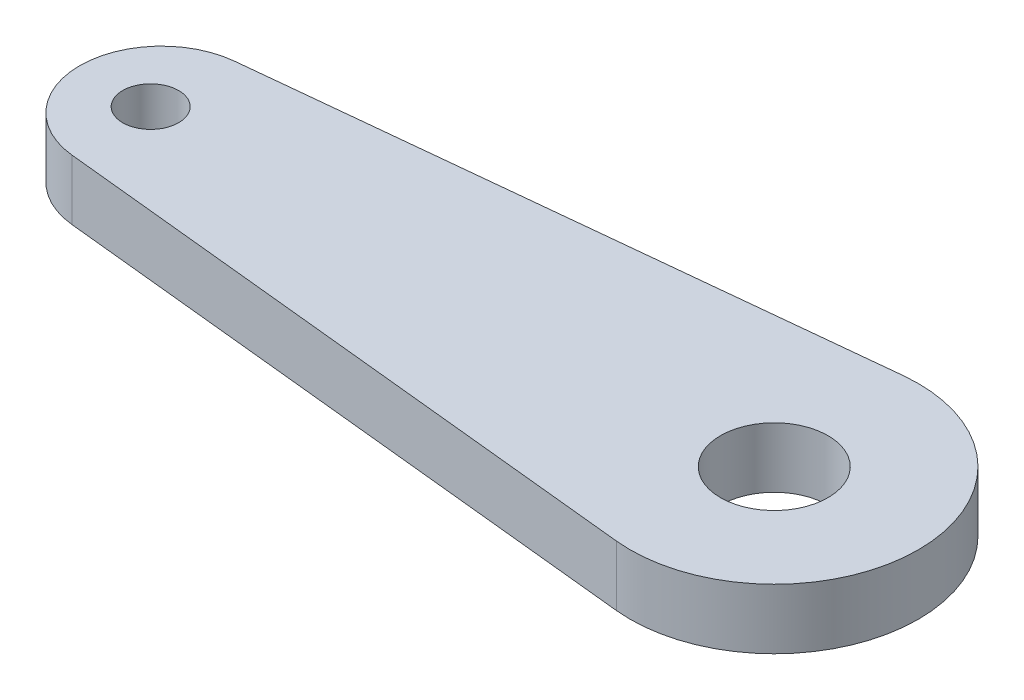
ISO-10303-21;
HEADER;
FILE_DESCRIPTION(('STEP AP214'),'2;1');
FILE_NAME('part.step','',(''),(''),'','','');
FILE_SCHEMA(('AUTOMOTIVE_DESIGN { 1 0 10303 214 1 1 1 1 }'));
ENDSEC;
DATA;
#1=APPLICATION_CONTEXT('core data for automotive mechanical design processes');
#2=APPLICATION_PROTOCOL_DEFINITION('international standard','automotive_design',2000,#1);
#3=PRODUCT_CONTEXT('',#1,'mechanical');
#4=PRODUCT('Part','Part','',(#3));
#5=PRODUCT_RELATED_PRODUCT_CATEGORY('part','',(#4));
#6=PRODUCT_DEFINITION_FORMATION('','',#4);
#7=PRODUCT_DEFINITION_CONTEXT('part definition',#1,'design');
#8=PRODUCT_DEFINITION('design','',#6,#7);
#9=PRODUCT_DEFINITION_SHAPE('','',#8);
#10=(LENGTH_UNIT() NAMED_UNIT(*) SI_UNIT(.MILLI.,.METRE.));
#11=(NAMED_UNIT(*) PLANE_ANGLE_UNIT() SI_UNIT($,.RADIAN.));
#12=(NAMED_UNIT(*) SI_UNIT($,.STERADIAN.) SOLID_ANGLE_UNIT());
#13=UNCERTAINTY_MEASURE_WITH_UNIT(LENGTH_MEASURE(1.E-05),#10,'distance_accuracy_value','');
#14=(GEOMETRIC_REPRESENTATION_CONTEXT(3) GLOBAL_UNCERTAINTY_ASSIGNED_CONTEXT((#13)) GLOBAL_UNIT_ASSIGNED_CONTEXT((#10,
#11,#12)) REPRESENTATION_CONTEXT('',''));
#15=CARTESIAN_POINT('',(0.,0.,0.));
#16=DIRECTION('',(0.,0.,1.));
#17=DIRECTION('',(1.,0.,0.));
#18=AXIS2_PLACEMENT_3D('',#15,#16,#17);
#19=CARTESIAN_POINT('',(-0.340877192982456,1.4,-3.33261199951396));
#20=DIRECTION('',(-0.101754385964912,0.,-0.994809552093718));
#21=DIRECTION('',(-0.994809552093718,0.,0.101754385964912));
#22=AXIS2_PLACEMENT_3D('',#19,#20,#21);
#23=PLANE('',#22);
#24=DIRECTION('',(0.994809552093718,0.,-0.101754385964912));
#25=VECTOR('',#24,1.);
#26=CARTESIAN_POINT('',(-0.340877192982456,0.,-3.33261199951396));
#27=LINE('',#26,#25);
#28=CARTESIAN_POINT('',(-14.4433333333333,0.,-1.89013814897806));
#29=VERTEX_POINT('',#28);
#30=CARTESIAN_POINT('',(-0.340877192982456,0.,-3.33261199951396));
#31=VERTEX_POINT('',#30);
#32=EDGE_CURVE('E112',#29,#31,#27,.T.);
#33=ORIENTED_EDGE('',*,*,#32,.F.);
#34=DIRECTION('',(0.,-1.,0.));
#35=VECTOR('',#34,1.);
#36=CARTESIAN_POINT('',(-14.4433333333333,1.4,-1.89013814897806));
#37=LINE('',#36,#35);
#38=CARTESIAN_POINT('',(-14.4433333333333,1.4,-1.89013814897806));
#39=VERTEX_POINT('',#38);
#40=EDGE_CURVE('E11',#39,#29,#37,.T.);
#41=ORIENTED_EDGE('',*,*,#40,.F.);
#42=DIRECTION('',(0.994809552093718,0.,-0.101754385964912));
#43=VECTOR('',#42,1.);
#44=CARTESIAN_POINT('',(-0.340877192982456,1.4,-3.33261199951396));
#45=LINE('',#44,#43);
#46=CARTESIAN_POINT('',(-0.340877192982456,1.4,-3.33261199951396));
#47=VERTEX_POINT('',#46);
#48=EDGE_CURVE('E94',#39,#47,#45,.T.);
#49=ORIENTED_EDGE('',*,*,#48,.T.);
#50=DIRECTION('',(0.,-1.,0.));
#51=VECTOR('',#50,1.);
#52=CARTESIAN_POINT('',(-0.340877192982456,1.4,-3.33261199951396));
#53=LINE('',#52,#51);
#54=EDGE_CURVE('E82',#47,#31,#53,.T.);
#55=ORIENTED_EDGE('',*,*,#54,.T.);
#56=EDGE_LOOP('',(#33,#41,#49,#55));
#57=FACE_BOUND('',#56,.T.);
#58=ADVANCED_FACE('F43',(#57),#23,.T.);
#59=CARTESIAN_POINT('',(-14.25,1.4,0.));
#60=DIRECTION('',(0.,-1.,0.));
#61=DIRECTION('',(0.,0.,-1.));
#62=AXIS2_PLACEMENT_3D('',#59,#60,#61);
#63=CYLINDRICAL_SURFACE('',#62,1.9);
#64=CARTESIAN_POINT('',(-14.25,0.,0.));
#65=DIRECTION('',(0.,1.,0.));
#66=DIRECTION('',(0.,0.,1.));
#67=AXIS2_PLACEMENT_3D('',#64,#65,#66);
#68=CIRCLE('',#67,1.9);
#69=CARTESIAN_POINT('',(-14.4433333333333,0.,1.89013814897806));
#70=VERTEX_POINT('',#69);
#71=EDGE_CURVE('E99',#29,#70,#68,.T.);
#72=ORIENTED_EDGE('',*,*,#71,.T.);
#73=DIRECTION('',(0.,-1.,0.));
#74=VECTOR('',#73,1.);
#75=CARTESIAN_POINT('',(-14.4433333333333,1.4,1.89013814897806));
#76=LINE('',#75,#74);
#77=CARTESIAN_POINT('',(-14.4433333333333,1.4,1.89013814897806));
#78=VERTEX_POINT('',#77);
#79=EDGE_CURVE('E51',#78,#70,#76,.T.);
#80=ORIENTED_EDGE('',*,*,#79,.F.);
#81=CARTESIAN_POINT('',(-14.25,1.4,0.));
#82=DIRECTION('',(0.,1.,0.));
#83=DIRECTION('',(0.,0.,1.));
#84=AXIS2_PLACEMENT_3D('',#81,#82,#83);
#85=CIRCLE('',#84,1.9);
#86=EDGE_CURVE('E88',#39,#78,#85,.T.);
#87=ORIENTED_EDGE('',*,*,#86,.F.);
#88=ORIENTED_EDGE('',*,*,#40,.T.);
#89=EDGE_LOOP('',(#72,#80,#87,#88));
#90=FACE_BOUND('',#89,.T.);
#91=ADVANCED_FACE('F97',(#90),#63,.T.);
#92=CARTESIAN_POINT('',(-0.340877192982456,1.4,3.33261199951395));
#93=DIRECTION('',(0.101754385964912,0.,-0.994809552093718));
#94=DIRECTION('',(-0.994809552093718,0.,-0.101754385964912));
#95=AXIS2_PLACEMENT_3D('',#92,#93,#94);
#96=PLANE('',#95);
#97=DIRECTION('',(0.994809552093718,0.,0.101754385964912));
#98=VECTOR('',#97,1.);
#99=CARTESIAN_POINT('',(-0.340877192982456,0.,3.33261199951395));
#100=LINE('',#99,#98);
#101=CARTESIAN_POINT('',(-0.340877192982456,0.,3.33261199951396));
#102=VERTEX_POINT('',#101);
#103=EDGE_CURVE('E75',#70,#102,#100,.T.);
#104=ORIENTED_EDGE('',*,*,#103,.T.);
#105=DIRECTION('',(0.,-1.,0.));
#106=VECTOR('',#105,1.);
#107=CARTESIAN_POINT('',(-0.340877192982456,1.4,3.33261199951396));
#108=LINE('',#107,#106);
#109=CARTESIAN_POINT('',(-0.340877192982456,1.4,3.33261199951396));
#110=VERTEX_POINT('',#109);
#111=EDGE_CURVE('E100',#110,#102,#108,.T.);
#112=ORIENTED_EDGE('',*,*,#111,.F.);
#113=DIRECTION('',(0.994809552093718,0.,0.101754385964912));
#114=VECTOR('',#113,1.);
#115=CARTESIAN_POINT('',(-0.340877192982456,1.4,3.33261199951395));
#116=LINE('',#115,#114);
#117=EDGE_CURVE('E93',#78,#110,#116,.T.);
#118=ORIENTED_EDGE('',*,*,#117,.F.);
#119=ORIENTED_EDGE('',*,*,#79,.T.);
#120=EDGE_LOOP('',(#104,#112,#118,#119));
#121=FACE_BOUND('',#120,.T.);
#122=ADVANCED_FACE('F101',(#121),#96,.F.);
#123=CARTESIAN_POINT('',(0.,1.4,0.));
#124=DIRECTION('',(0.,-1.,0.));
#125=DIRECTION('',(0.,0.,-1.));
#126=AXIS2_PLACEMENT_3D('',#123,#124,#125);
#127=CYLINDRICAL_SURFACE('',#126,1.25);
#128=CARTESIAN_POINT('',(0.,1.4,0.));
#129=DIRECTION('',(0.,1.,0.));
#130=DIRECTION('',(0.,0.,1.));
#131=AXIS2_PLACEMENT_3D('',#128,#129,#130);
#132=CIRCLE('',#131,1.25);
#133=CARTESIAN_POINT('',(0.,1.4,1.25));
#134=VERTEX_POINT('',#133);
#135=EDGE_CURVE('E103',#134,#134,#132,.T.);
#136=ORIENTED_EDGE('',*,*,#135,.T.);
#137=EDGE_LOOP('',(#136));
#138=FACE_BOUND('',#137,.T.);
#139=CARTESIAN_POINT('',(0.,0.,0.));
#140=DIRECTION('',(0.,1.,0.));
#141=DIRECTION('',(0.,0.,1.));
#142=AXIS2_PLACEMENT_3D('',#139,#140,#141);
#143=CIRCLE('',#142,1.25);
#144=CARTESIAN_POINT('',(0.,0.,1.25));
#145=VERTEX_POINT('',#144);
#146=EDGE_CURVE('E119',#145,#145,#143,.T.);
#147=ORIENTED_EDGE('',*,*,#146,.F.);
#148=EDGE_LOOP('',(#147));
#149=FACE_BOUND('',#148,.T.);
#150=ADVANCED_FACE('F139',(#138,#149),#127,.F.);
#151=CARTESIAN_POINT('',(0.,1.4,0.));
#152=DIRECTION('',(0.,-1.,0.));
#153=DIRECTION('',(0.,0.,-1.));
#154=AXIS2_PLACEMENT_3D('',#151,#152,#153);
#155=CYLINDRICAL_SURFACE('',#154,3.35);
#156=CARTESIAN_POINT('',(0.,0.,0.));
#157=DIRECTION('',(0.,1.,0.));
#158=DIRECTION('',(0.,0.,1.));
#159=AXIS2_PLACEMENT_3D('',#156,#157,#158);
#160=CIRCLE('',#159,3.35);
#161=EDGE_CURVE('E117',#102,#31,#160,.T.);
#162=ORIENTED_EDGE('',*,*,#161,.T.);
#163=ORIENTED_EDGE('',*,*,#54,.F.);
#164=CARTESIAN_POINT('',(0.,1.4,0.));
#165=DIRECTION('',(0.,1.,0.));
#166=DIRECTION('',(0.,0.,1.));
#167=AXIS2_PLACEMENT_3D('',#164,#165,#166);
#168=CIRCLE('',#167,3.35);
#169=EDGE_CURVE('E59',#110,#47,#168,.T.);
#170=ORIENTED_EDGE('',*,*,#169,.F.);
#171=ORIENTED_EDGE('',*,*,#111,.T.);
#172=EDGE_LOOP('',(#162,#163,#170,#171));
#173=FACE_BOUND('',#172,.T.);
#174=ADVANCED_FACE('F128',(#173),#155,.T.);
#175=CARTESIAN_POINT('',(-14.5,1.4,0.));
#176=DIRECTION('',(0.,-1.,0.));
#177=DIRECTION('',(0.,0.,-1.));
#178=AXIS2_PLACEMENT_3D('',#175,#176,#177);
#179=CYLINDRICAL_SURFACE('',#178,0.649999999999999);
#180=CARTESIAN_POINT('',(-14.5,1.4,0.));
#181=DIRECTION('',(0.,1.,0.));
#182=DIRECTION('',(0.,0.,1.));
#183=AXIS2_PLACEMENT_3D('',#180,#181,#182);
#184=CIRCLE('',#183,0.649999999999999);
#185=CARTESIAN_POINT('',(-14.5,1.4,0.649999999999999));
#186=VERTEX_POINT('',#185);
#187=EDGE_CURVE('E109',#186,#186,#184,.T.);
#188=ORIENTED_EDGE('',*,*,#187,.T.);
#189=EDGE_LOOP('',(#188));
#190=FACE_BOUND('',#189,.T.);
#191=CARTESIAN_POINT('',(-14.5,0.,0.));
#192=DIRECTION('',(0.,1.,0.));
#193=DIRECTION('',(0.,0.,1.));
#194=AXIS2_PLACEMENT_3D('',#191,#192,#193);
#195=CIRCLE('',#194,0.649999999999999);
#196=CARTESIAN_POINT('',(-14.5,0.,0.649999999999999));
#197=VERTEX_POINT('',#196);
#198=EDGE_CURVE('E122',#197,#197,#195,.T.);
#199=ORIENTED_EDGE('',*,*,#198,.F.);
#200=EDGE_LOOP('',(#199));
#201=FACE_BOUND('',#200,.T.);
#202=ADVANCED_FACE('F144',(#190,#201),#179,.F.);
#203=CARTESIAN_POINT('',(0.,1.4,0.));
#204=DIRECTION('',(0.,1.,0.));
#205=DIRECTION('',(0.,0.,1.));
#206=AXIS2_PLACEMENT_3D('',#203,#204,#205);
#207=PLANE('',#206);
#208=ORIENTED_EDGE('',*,*,#48,.F.);
#209=ORIENTED_EDGE('',*,*,#86,.T.);
#210=ORIENTED_EDGE('',*,*,#117,.T.);
#211=ORIENTED_EDGE('',*,*,#169,.T.);
#212=EDGE_LOOP('',(#208,#209,#210,#211));
#213=FACE_BOUND('',#212,.T.);
#214=ORIENTED_EDGE('',*,*,#135,.F.);
#215=EDGE_LOOP('',(#214));
#216=FACE_BOUND('',#215,.T.);
#217=ORIENTED_EDGE('',*,*,#187,.F.);
#218=EDGE_LOOP('',(#217));
#219=FACE_BOUND('',#218,.T.);
#220=ADVANCED_FACE('F90',(#213,#216,#219),#207,.T.);
#221=CARTESIAN_POINT('',(0.,0.,0.));
#222=DIRECTION('',(0.,1.,0.));
#223=DIRECTION('',(0.,0.,1.));
#224=AXIS2_PLACEMENT_3D('',#221,#222,#223);
#225=PLANE('',#224);
#226=ORIENTED_EDGE('',*,*,#32,.T.);
#227=ORIENTED_EDGE('',*,*,#161,.F.);
#228=ORIENTED_EDGE('',*,*,#103,.F.);
#229=ORIENTED_EDGE('',*,*,#71,.F.);
#230=EDGE_LOOP('',(#226,#227,#228,#229));
#231=FACE_BOUND('',#230,.T.);
#232=ORIENTED_EDGE('',*,*,#146,.T.);
#233=EDGE_LOOP('',(#232));
#234=FACE_BOUND('',#233,.T.);
#235=ORIENTED_EDGE('',*,*,#198,.T.);
#236=EDGE_LOOP('',(#235));
#237=FACE_BOUND('',#236,.T.);
#238=ADVANCED_FACE('F130',(#231,#234,#237),#225,.F.);
#239=CLOSED_SHELL('',(#58,#91,#122,#150,#174,#202,#220,#238));
#240=MANIFOLD_SOLID_BREP('B2',#239);
#241=ADVANCED_BREP_SHAPE_REPRESENTATION('',(#18,#240),#14);
#242=SHAPE_DEFINITION_REPRESENTATION(#9,#241);
ENDSEC;
END-ISO-10303-21;
